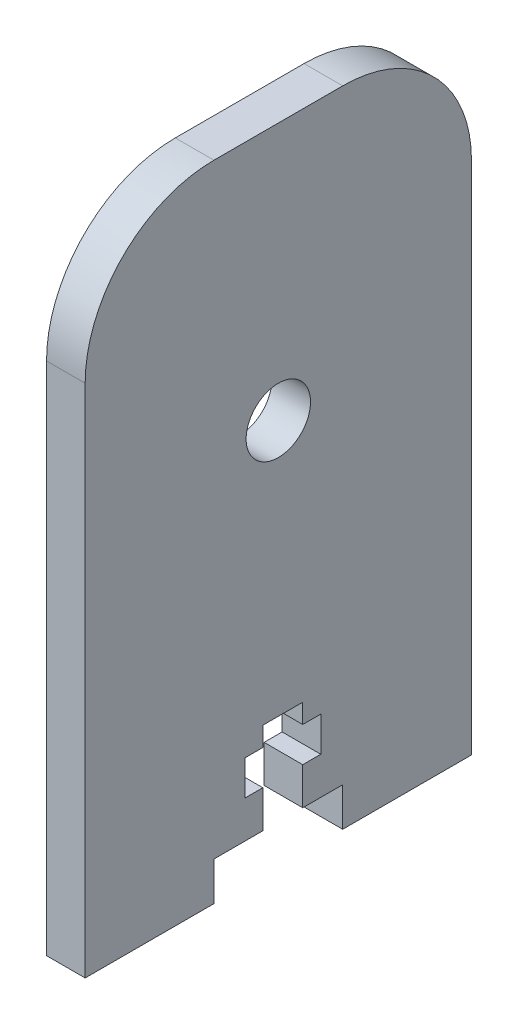
ISO-10303-21;
HEADER;
FILE_DESCRIPTION(('STEP AP214'),'2;1');
FILE_NAME('part.step','',(''),(''),'','','');
FILE_SCHEMA(('AUTOMOTIVE_DESIGN { 1 0 10303 214 1 1 1 1 }'));
ENDSEC;
DATA;
#1=APPLICATION_CONTEXT('core data for automotive mechanical design processes');
#2=APPLICATION_PROTOCOL_DEFINITION('international standard','automotive_design',2000,#1);
#3=PRODUCT_CONTEXT('',#1,'mechanical');
#4=PRODUCT('Part','Part','',(#3));
#5=PRODUCT_RELATED_PRODUCT_CATEGORY('part','',(#4));
#6=PRODUCT_DEFINITION_FORMATION('','',#4);
#7=PRODUCT_DEFINITION_CONTEXT('part definition',#1,'design');
#8=PRODUCT_DEFINITION('design','',#6,#7);
#9=PRODUCT_DEFINITION_SHAPE('','',#8);
#10=(LENGTH_UNIT() NAMED_UNIT(*) SI_UNIT(.MILLI.,.METRE.));
#11=(NAMED_UNIT(*) PLANE_ANGLE_UNIT() SI_UNIT($,.RADIAN.));
#12=(NAMED_UNIT(*) SI_UNIT($,.STERADIAN.) SOLID_ANGLE_UNIT());
#13=UNCERTAINTY_MEASURE_WITH_UNIT(LENGTH_MEASURE(1.E-05),#10,'distance_accuracy_value','');
#14=(GEOMETRIC_REPRESENTATION_CONTEXT(3) GLOBAL_UNCERTAINTY_ASSIGNED_CONTEXT((#13)) GLOBAL_UNIT_ASSIGNED_CONTEXT((#10,
#11,#12)) REPRESENTATION_CONTEXT('',''));
#15=CARTESIAN_POINT('',(0.,0.,0.));
#16=DIRECTION('',(0.,0.,1.));
#17=DIRECTION('',(1.,0.,0.));
#18=AXIS2_PLACEMENT_3D('',#15,#16,#17);
#19=CARTESIAN_POINT('',(0.,3.,-10.));
#20=DIRECTION('',(0.,1.,0.));
#21=DIRECTION('',(0.,0.,1.));
#22=AXIS2_PLACEMENT_3D('',#19,#20,#21);
#23=PLANE('',#22);
#24=DIRECTION('',(0.,0.,1.));
#25=VECTOR('',#24,1.);
#26=CARTESIAN_POINT('',(0.,3.,-10.));
#27=LINE('',#26,#25);
#28=CARTESIAN_POINT('',(0.,3.,-13.796178668585));
#29=VERTEX_POINT('',#28);
#30=CARTESIAN_POINT('',(0.,3.,-10.));
#31=VERTEX_POINT('',#30);
#32=EDGE_CURVE('E292',#29,#31,#27,.T.);
#33=ORIENTED_EDGE('',*,*,#32,.F.);
#34=DIRECTION('',(1.,0.,0.));
#35=VECTOR('',#34,1.);
#36=CARTESIAN_POINT('',(0.,3.,-13.796178668585));
#37=LINE('',#36,#35);
#38=CARTESIAN_POINT('',(3.,3.,-13.796178668585));
#39=VERTEX_POINT('',#38);
#40=EDGE_CURVE('E258',#29,#39,#37,.T.);
#41=ORIENTED_EDGE('',*,*,#40,.T.);
#42=DIRECTION('',(0.,0.,1.));
#43=VECTOR('',#42,1.);
#44=CARTESIAN_POINT('',(3.,3.,-10.));
#45=LINE('',#44,#43);
#46=CARTESIAN_POINT('',(3.,3.,-10.));
#47=VERTEX_POINT('',#46);
#48=EDGE_CURVE('E299',#39,#47,#45,.T.);
#49=ORIENTED_EDGE('',*,*,#48,.T.);
#50=DIRECTION('',(1.,0.,0.));
#51=VECTOR('',#50,1.);
#52=CARTESIAN_POINT('',(0.,3.,-10.));
#53=LINE('',#52,#51);
#54=EDGE_CURVE('E302',#31,#47,#53,.T.);
#55=ORIENTED_EDGE('',*,*,#54,.F.);
#56=EDGE_LOOP('',(#33,#41,#49,#55));
#57=FACE_BOUND('',#56,.T.);
#58=ADVANCED_FACE('F33',(#57),#23,.F.);
#59=CARTESIAN_POINT('',(3.,0.,0.));
#60=DIRECTION('',(0.,1.,0.));
#61=DIRECTION('',(0.,0.,1.));
#62=AXIS2_PLACEMENT_3D('',#59,#60,#61);
#63=PLANE('',#62);
#64=DIRECTION('',(0.,0.,-1.));
#65=VECTOR('',#64,1.);
#66=CARTESIAN_POINT('',(0.,0.,0.));
#67=LINE('',#66,#65);
#68=CARTESIAN_POINT('',(0.,0.,0.));
#69=VERTEX_POINT('',#68);
#70=CARTESIAN_POINT('',(0.,0.,-10.));
#71=VERTEX_POINT('',#70);
#72=EDGE_CURVE('E328',#69,#71,#67,.T.);
#73=ORIENTED_EDGE('',*,*,#72,.T.);
#74=DIRECTION('',(1.,0.,0.));
#75=VECTOR('',#74,1.);
#76=CARTESIAN_POINT('',(0.,0.,-10.));
#77=LINE('',#76,#75);
#78=CARTESIAN_POINT('',(3.,0.,-10.));
#79=VERTEX_POINT('',#78);
#80=EDGE_CURVE('E294',#71,#79,#77,.T.);
#81=ORIENTED_EDGE('',*,*,#80,.T.);
#82=DIRECTION('',(0.,0.,-1.));
#83=VECTOR('',#82,1.);
#84=CARTESIAN_POINT('',(3.,0.,0.));
#85=LINE('',#84,#83);
#86=CARTESIAN_POINT('',(3.,0.,0.));
#87=VERTEX_POINT('',#86);
#88=EDGE_CURVE('E316',#87,#79,#85,.T.);
#89=ORIENTED_EDGE('',*,*,#88,.F.);
#90=DIRECTION('',(-1.,0.,0.));
#91=VECTOR('',#90,1.);
#92=CARTESIAN_POINT('',(3.,0.,0.));
#93=LINE('',#92,#91);
#94=EDGE_CURVE('E338',#87,#69,#93,.T.);
#95=ORIENTED_EDGE('',*,*,#94,.T.);
#96=EDGE_LOOP('',(#73,#81,#89,#95));
#97=FACE_BOUND('',#96,.T.);
#98=ADVANCED_FACE('F426',(#97),#63,.F.);
#99=CARTESIAN_POINT('',(3.,0.,0.));
#100=DIRECTION('',(0.,0.,-1.));
#101=DIRECTION('',(-1.,0.,0.));
#102=AXIS2_PLACEMENT_3D('',#99,#100,#101);
#103=PLANE('',#102);
#104=DIRECTION('',(0.,-1.,0.));
#105=VECTOR('',#104,1.);
#106=CARTESIAN_POINT('',(3.,0.,0.));
#107=LINE('',#106,#105);
#108=CARTESIAN_POINT('',(3.,40.,0.));
#109=VERTEX_POINT('',#108);
#110=EDGE_CURVE('E312',#109,#87,#107,.T.);
#111=ORIENTED_EDGE('',*,*,#110,.F.);
#112=DIRECTION('',(-1.,0.,0.));
#113=VECTOR('',#112,1.);
#114=CARTESIAN_POINT('',(3.,40.,0.));
#115=LINE('',#114,#113);
#116=CARTESIAN_POINT('',(0.,40.,0.));
#117=VERTEX_POINT('',#116);
#118=EDGE_CURVE('E11',#109,#117,#115,.T.);
#119=ORIENTED_EDGE('',*,*,#118,.T.);
#120=DIRECTION('',(0.,-1.,0.));
#121=VECTOR('',#120,1.);
#122=CARTESIAN_POINT('',(0.,0.,0.));
#123=LINE('',#122,#121);
#124=EDGE_CURVE('E305',#117,#69,#123,.T.);
#125=ORIENTED_EDGE('',*,*,#124,.T.);
#126=ORIENTED_EDGE('',*,*,#94,.F.);
#127=EDGE_LOOP('',(#111,#119,#125,#126));
#128=FACE_BOUND('',#127,.T.);
#129=ADVANCED_FACE('F432',(#128),#103,.F.);
#130=CARTESIAN_POINT('',(3.,0.,-20.));
#131=VERTEX_POINT('',#130);
#132=CARTESIAN_POINT('',(3.,0.,-30.));
#133=VERTEX_POINT('',#132);
#134=EDGE_CURVE('E314',#131,#133,#85,.T.);
#135=ORIENTED_EDGE('',*,*,#134,.F.);
#136=DIRECTION('',(1.,0.,0.));
#137=VECTOR('',#136,1.);
#138=CARTESIAN_POINT('',(0.,0.,-20.));
#139=LINE('',#138,#137);
#140=CARTESIAN_POINT('',(0.,0.,-20.));
#141=VERTEX_POINT('',#140);
#142=EDGE_CURVE('E308',#141,#131,#139,.T.);
#143=ORIENTED_EDGE('',*,*,#142,.F.);
#144=CARTESIAN_POINT('',(0.,0.,-30.));
#145=VERTEX_POINT('',#144);
#146=EDGE_CURVE('E327',#141,#145,#67,.T.);
#147=ORIENTED_EDGE('',*,*,#146,.T.);
#148=DIRECTION('',(-1.,0.,0.));
#149=VECTOR('',#148,1.);
#150=CARTESIAN_POINT('',(3.,0.,-30.));
#151=LINE('',#150,#149);
#152=EDGE_CURVE('E325',#133,#145,#151,.T.);
#153=ORIENTED_EDGE('',*,*,#152,.F.);
#154=EDGE_LOOP('',(#135,#143,#147,#153));
#155=FACE_BOUND('',#154,.T.);
#156=ADVANCED_FACE('F375',(#155),#63,.F.);
#157=CARTESIAN_POINT('',(3.,0.,-30.));
#158=DIRECTION('',(0.,0.,1.));
#159=DIRECTION('',(1.,0.,0.));
#160=AXIS2_PLACEMENT_3D('',#157,#158,#159);
#161=PLANE('',#160);
#162=DIRECTION('',(0.,1.,0.));
#163=VECTOR('',#162,1.);
#164=CARTESIAN_POINT('',(0.,0.,-30.));
#165=LINE('',#164,#163);
#166=CARTESIAN_POINT('',(0.,40.,-30.));
#167=VERTEX_POINT('',#166);
#168=EDGE_CURVE('E331',#145,#167,#165,.T.);
#169=ORIENTED_EDGE('',*,*,#168,.T.);
#170=DIRECTION('',(-1.,0.,0.));
#171=VECTOR('',#170,1.);
#172=CARTESIAN_POINT('',(3.,40.,-30.));
#173=LINE('',#172,#171);
#174=CARTESIAN_POINT('',(3.,40.,-30.));
#175=VERTEX_POINT('',#174);
#176=EDGE_CURVE('E350',#167,#175,#173,.F.);
#177=ORIENTED_EDGE('',*,*,#176,.T.);
#178=DIRECTION('',(0.,1.,0.));
#179=VECTOR('',#178,1.);
#180=CARTESIAN_POINT('',(3.,0.,-30.));
#181=LINE('',#180,#179);
#182=EDGE_CURVE('E319',#133,#175,#181,.T.);
#183=ORIENTED_EDGE('',*,*,#182,.F.);
#184=ORIENTED_EDGE('',*,*,#152,.T.);
#185=EDGE_LOOP('',(#169,#177,#183,#184));
#186=FACE_BOUND('',#185,.T.);
#187=ADVANCED_FACE('F371',(#186),#161,.F.);
#188=CARTESIAN_POINT('',(3.,50.,0.));
#189=DIRECTION('',(0.,-1.,0.));
#190=DIRECTION('',(0.,0.,-1.));
#191=AXIS2_PLACEMENT_3D('',#188,#189,#190);
#192=PLANE('',#191);
#193=DIRECTION('',(0.,0.,1.));
#194=VECTOR('',#193,1.);
#195=CARTESIAN_POINT('',(3.,50.,0.));
#196=LINE('',#195,#194);
#197=CARTESIAN_POINT('',(3.,50.,-20.));
#198=VERTEX_POINT('',#197);
#199=CARTESIAN_POINT('',(3.,50.,-10.));
#200=VERTEX_POINT('',#199);
#201=EDGE_CURVE('E322',#198,#200,#196,.T.);
#202=ORIENTED_EDGE('',*,*,#201,.F.);
#203=DIRECTION('',(-1.,0.,0.));
#204=VECTOR('',#203,1.);
#205=CARTESIAN_POINT('',(3.,50.,-20.));
#206=LINE('',#205,#204);
#207=CARTESIAN_POINT('',(0.,50.,-20.));
#208=VERTEX_POINT('',#207);
#209=EDGE_CURVE('E343',#198,#208,#206,.T.);
#210=ORIENTED_EDGE('',*,*,#209,.T.);
#211=DIRECTION('',(0.,0.,1.));
#212=VECTOR('',#211,1.);
#213=CARTESIAN_POINT('',(0.,50.,0.));
#214=LINE('',#213,#212);
#215=CARTESIAN_POINT('',(0.,50.,-10.));
#216=VERTEX_POINT('',#215);
#217=EDGE_CURVE('E315',#208,#216,#214,.T.);
#218=ORIENTED_EDGE('',*,*,#217,.T.);
#219=DIRECTION('',(-1.,0.,0.));
#220=VECTOR('',#219,1.);
#221=CARTESIAN_POINT('',(3.,50.,-10.));
#222=LINE('',#221,#220);
#223=EDGE_CURVE('E341',#216,#200,#222,.F.);
#224=ORIENTED_EDGE('',*,*,#223,.T.);
#225=EDGE_LOOP('',(#202,#210,#218,#224));
#226=FACE_BOUND('',#225,.T.);
#227=ADVANCED_FACE('F364',(#226),#192,.F.);
#228=CARTESIAN_POINT('',(3.,0.,0.));
#229=DIRECTION('',(-1.,0.,0.));
#230=DIRECTION('',(0.,0.,1.));
#231=AXIS2_PLACEMENT_3D('',#228,#229,#230);
#232=PLANE('',#231);
#233=CARTESIAN_POINT('',(3.,30.,-15.));
#234=DIRECTION('',(1.,0.,0.));
#235=DIRECTION('',(0.,0.,-1.));
#236=AXIS2_PLACEMENT_3D('',#233,#234,#235);
#237=CIRCLE('',#236,2.5);
#238=CARTESIAN_POINT('',(3.,30.,-17.5));
#239=VERTEX_POINT('',#238);
#240=EDGE_CURVE('E261',#239,#239,#237,.T.);
#241=ORIENTED_EDGE('',*,*,#240,.F.);
#242=EDGE_LOOP('',(#241));
#243=FACE_BOUND('',#242,.T.);
#244=ORIENTED_EDGE('',*,*,#48,.F.);
#245=DIRECTION('',(0.,-1.,0.));
#246=VECTOR('',#245,1.);
#247=CARTESIAN_POINT('',(3.,3.,-13.796178668585));
#248=LINE('',#247,#246);
#249=CARTESIAN_POINT('',(3.,5.9,-13.796178668585));
#250=VERTEX_POINT('',#249);
#251=EDGE_CURVE('E203',#250,#39,#248,.T.);
#252=ORIENTED_EDGE('',*,*,#251,.F.);
#253=DIRECTION('',(0.,0.,-1.));
#254=VECTOR('',#253,1.);
#255=CARTESIAN_POINT('',(3.,5.9,-13.796178668585));
#256=LINE('',#255,#254);
#257=CARTESIAN_POINT('',(3.,5.9,-12.396178668585));
#258=VERTEX_POINT('',#257);
#259=EDGE_CURVE('E205',#258,#250,#256,.T.);
#260=ORIENTED_EDGE('',*,*,#259,.F.);
#261=DIRECTION('',(0.,-1.,0.));
#262=VECTOR('',#261,1.);
#263=CARTESIAN_POINT('',(3.,5.9,-12.396178668585));
#264=LINE('',#263,#262);
#265=CARTESIAN_POINT('',(3.,8.6,-12.396178668585));
#266=VERTEX_POINT('',#265);
#267=EDGE_CURVE('E253',#266,#258,#264,.T.);
#268=ORIENTED_EDGE('',*,*,#267,.F.);
#269=DIRECTION('',(0.,0.,1.));
#270=VECTOR('',#269,1.);
#271=CARTESIAN_POINT('',(3.,8.6,-12.396178668585));
#272=LINE('',#271,#270);
#273=CARTESIAN_POINT('',(3.,8.6,-13.796178668585));
#274=VERTEX_POINT('',#273);
#275=EDGE_CURVE('E250',#274,#266,#272,.T.);
#276=ORIENTED_EDGE('',*,*,#275,.F.);
#277=DIRECTION('',(0.,-1.,0.));
#278=VECTOR('',#277,1.);
#279=CARTESIAN_POINT('',(3.,8.6,-13.796178668585));
#280=LINE('',#279,#278);
#281=CARTESIAN_POINT('',(3.,10.1,-13.796178668585));
#282=VERTEX_POINT('',#281);
#283=EDGE_CURVE('E247',#282,#274,#280,.T.);
#284=ORIENTED_EDGE('',*,*,#283,.F.);
#285=DIRECTION('',(0.,0.,1.));
#286=VECTOR('',#285,1.);
#287=CARTESIAN_POINT('',(3.,10.1,-13.796178668585));
#288=LINE('',#287,#286);
#289=CARTESIAN_POINT('',(3.,10.1,-16.896178668585));
#290=VERTEX_POINT('',#289);
#291=EDGE_CURVE('E244',#290,#282,#288,.T.);
#292=ORIENTED_EDGE('',*,*,#291,.F.);
#293=DIRECTION('',(0.,1.,0.));
#294=VECTOR('',#293,1.);
#295=CARTESIAN_POINT('',(3.,10.1,-16.896178668585));
#296=LINE('',#295,#294);
#297=CARTESIAN_POINT('',(3.,8.6,-16.896178668585));
#298=VERTEX_POINT('',#297);
#299=EDGE_CURVE('E241',#298,#290,#296,.T.);
#300=ORIENTED_EDGE('',*,*,#299,.F.);
#301=DIRECTION('',(0.,0.,1.));
#302=VECTOR('',#301,1.);
#303=CARTESIAN_POINT('',(3.,8.6,-16.896178668585));
#304=LINE('',#303,#302);
#305=CARTESIAN_POINT('',(3.,8.6,-18.296178668585));
#306=VERTEX_POINT('',#305);
#307=EDGE_CURVE('E238',#306,#298,#304,.T.);
#308=ORIENTED_EDGE('',*,*,#307,.F.);
#309=DIRECTION('',(0.,1.,0.));
#310=VECTOR('',#309,1.);
#311=CARTESIAN_POINT('',(3.,8.6,-18.296178668585));
#312=LINE('',#311,#310);
#313=CARTESIAN_POINT('',(3.,5.9,-18.296178668585));
#314=VERTEX_POINT('',#313);
#315=EDGE_CURVE('E235',#314,#306,#312,.T.);
#316=ORIENTED_EDGE('',*,*,#315,.F.);
#317=DIRECTION('',(0.,0.,-1.));
#318=VECTOR('',#317,1.);
#319=CARTESIAN_POINT('',(3.,5.9,-18.296178668585));
#320=LINE('',#319,#318);
#321=CARTESIAN_POINT('',(3.,5.9,-16.896178668585));
#322=VERTEX_POINT('',#321);
#323=EDGE_CURVE('E233',#322,#314,#320,.T.);
#324=ORIENTED_EDGE('',*,*,#323,.F.);
#325=DIRECTION('',(0.,1.,0.));
#326=VECTOR('',#325,1.);
#327=CARTESIAN_POINT('',(3.,5.9,-16.896178668585));
#328=LINE('',#327,#326);
#329=CARTESIAN_POINT('',(3.,3.,-16.896178668585));
#330=VERTEX_POINT('',#329);
#331=EDGE_CURVE('E184',#330,#322,#328,.T.);
#332=ORIENTED_EDGE('',*,*,#331,.F.);
#333=CARTESIAN_POINT('',(3.,3.,-20.));
#334=VERTEX_POINT('',#333);
#335=EDGE_CURVE('E290',#334,#330,#45,.T.);
#336=ORIENTED_EDGE('',*,*,#335,.F.);
#337=DIRECTION('',(0.,1.,0.));
#338=VECTOR('',#337,1.);
#339=CARTESIAN_POINT('',(3.,0.,-20.));
#340=LINE('',#339,#338);
#341=EDGE_CURVE('E296',#131,#334,#340,.T.);
#342=ORIENTED_EDGE('',*,*,#341,.F.);
#343=ORIENTED_EDGE('',*,*,#134,.T.);
#344=ORIENTED_EDGE('',*,*,#182,.T.);
#345=CARTESIAN_POINT('',(3.,40.,-20.));
#346=DIRECTION('',(-1.,0.,0.));
#347=DIRECTION('',(0.,0.,1.));
#348=AXIS2_PLACEMENT_3D('',#345,#346,#347);
#349=CIRCLE('',#348,10.);
#350=EDGE_CURVE('E41',#175,#198,#349,.F.);
#351=ORIENTED_EDGE('',*,*,#350,.T.);
#352=ORIENTED_EDGE('',*,*,#201,.T.);
#353=CARTESIAN_POINT('',(3.,40.,-10.));
#354=DIRECTION('',(-1.,0.,0.));
#355=DIRECTION('',(0.,0.,1.));
#356=AXIS2_PLACEMENT_3D('',#353,#354,#355);
#357=CIRCLE('',#356,10.);
#358=EDGE_CURVE('E352',#200,#109,#357,.F.);
#359=ORIENTED_EDGE('',*,*,#358,.T.);
#360=ORIENTED_EDGE('',*,*,#110,.T.);
#361=ORIENTED_EDGE('',*,*,#88,.T.);
#362=DIRECTION('',(0.,-1.,0.));
#363=VECTOR('',#362,1.);
#364=CARTESIAN_POINT('',(3.,0.,-10.));
#365=LINE('',#364,#363);
#366=EDGE_CURVE('E285',#47,#79,#365,.T.);
#367=ORIENTED_EDGE('',*,*,#366,.F.);
#368=EDGE_LOOP('',(#244,#252,#260,#268,#276,#284,#292,#300,#308,#316,#324,#332,#336,#342,#343,
#344,#351,#352,#359,#360,#361,#367));
#369=FACE_BOUND('',#368,.T.);
#370=ADVANCED_FACE('F357',(#243,#369),#232,.F.);
#371=CARTESIAN_POINT('',(0.,0.,0.));
#372=DIRECTION('',(-1.,0.,0.));
#373=DIRECTION('',(0.,0.,1.));
#374=AXIS2_PLACEMENT_3D('',#371,#372,#373);
#375=PLANE('',#374);
#376=DIRECTION('',(0.,-1.,0.));
#377=VECTOR('',#376,1.);
#378=CARTESIAN_POINT('',(0.,3.,-13.796178668585));
#379=LINE('',#378,#377);
#380=CARTESIAN_POINT('',(0.,5.9,-13.796178668585));
#381=VERTEX_POINT('',#380);
#382=EDGE_CURVE('E230',#381,#29,#379,.T.);
#383=ORIENTED_EDGE('',*,*,#382,.T.);
#384=ORIENTED_EDGE('',*,*,#32,.T.);
#385=DIRECTION('',(0.,-1.,0.));
#386=VECTOR('',#385,1.);
#387=CARTESIAN_POINT('',(0.,0.,-10.));
#388=LINE('',#387,#386);
#389=EDGE_CURVE('E286',#31,#71,#388,.T.);
#390=ORIENTED_EDGE('',*,*,#389,.T.);
#391=ORIENTED_EDGE('',*,*,#72,.F.);
#392=ORIENTED_EDGE('',*,*,#124,.F.);
#393=CARTESIAN_POINT('',(0.,40.,-10.));
#394=DIRECTION('',(-1.,0.,0.));
#395=DIRECTION('',(0.,0.,1.));
#396=AXIS2_PLACEMENT_3D('',#393,#394,#395);
#397=CIRCLE('',#396,10.);
#398=EDGE_CURVE('E346',#117,#216,#397,.T.);
#399=ORIENTED_EDGE('',*,*,#398,.T.);
#400=ORIENTED_EDGE('',*,*,#217,.F.);
#401=CARTESIAN_POINT('',(0.,40.,-20.));
#402=DIRECTION('',(-1.,0.,0.));
#403=DIRECTION('',(0.,0.,1.));
#404=AXIS2_PLACEMENT_3D('',#401,#402,#403);
#405=CIRCLE('',#404,10.);
#406=EDGE_CURVE('E348',#208,#167,#405,.T.);
#407=ORIENTED_EDGE('',*,*,#406,.T.);
#408=ORIENTED_EDGE('',*,*,#168,.F.);
#409=ORIENTED_EDGE('',*,*,#146,.F.);
#410=DIRECTION('',(0.,1.,0.));
#411=VECTOR('',#410,1.);
#412=CARTESIAN_POINT('',(0.,0.,-20.));
#413=LINE('',#412,#411);
#414=CARTESIAN_POINT('',(0.,3.,-20.));
#415=VERTEX_POINT('',#414);
#416=EDGE_CURVE('E289',#141,#415,#413,.T.);
#417=ORIENTED_EDGE('',*,*,#416,.T.);
#418=CARTESIAN_POINT('',(0.,3.,-16.896178668585));
#419=VERTEX_POINT('',#418);
#420=EDGE_CURVE('E55',#415,#419,#27,.T.);
#421=ORIENTED_EDGE('',*,*,#420,.T.);
#422=DIRECTION('',(0.,1.,0.));
#423=VECTOR('',#422,1.);
#424=CARTESIAN_POINT('',(0.,5.9,-16.896178668585));
#425=LINE('',#424,#423);
#426=CARTESIAN_POINT('',(0.,5.9,-16.896178668585));
#427=VERTEX_POINT('',#426);
#428=EDGE_CURVE('E48',#419,#427,#425,.T.);
#429=ORIENTED_EDGE('',*,*,#428,.T.);
#430=DIRECTION('',(0.,0.,-1.));
#431=VECTOR('',#430,1.);
#432=CARTESIAN_POINT('',(0.,5.9,-18.296178668585));
#433=LINE('',#432,#431);
#434=CARTESIAN_POINT('',(0.,5.9,-18.296178668585));
#435=VERTEX_POINT('',#434);
#436=EDGE_CURVE('E192',#427,#435,#433,.T.);
#437=ORIENTED_EDGE('',*,*,#436,.T.);
#438=DIRECTION('',(0.,1.,0.));
#439=VECTOR('',#438,1.);
#440=CARTESIAN_POINT('',(0.,8.6,-18.296178668585));
#441=LINE('',#440,#439);
#442=CARTESIAN_POINT('',(0.,8.6,-18.296178668585));
#443=VERTEX_POINT('',#442);
#444=EDGE_CURVE('E197',#435,#443,#441,.T.);
#445=ORIENTED_EDGE('',*,*,#444,.T.);
#446=DIRECTION('',(0.,0.,1.));
#447=VECTOR('',#446,1.);
#448=CARTESIAN_POINT('',(0.,8.6,-16.896178668585));
#449=LINE('',#448,#447);
#450=CARTESIAN_POINT('',(0.,8.6,-16.896178668585));
#451=VERTEX_POINT('',#450);
#452=EDGE_CURVE('E209',#443,#451,#449,.T.);
#453=ORIENTED_EDGE('',*,*,#452,.T.);
#454=DIRECTION('',(0.,1.,0.));
#455=VECTOR('',#454,1.);
#456=CARTESIAN_POINT('',(0.,10.1,-16.896178668585));
#457=LINE('',#456,#455);
#458=CARTESIAN_POINT('',(0.,10.1,-16.896178668585));
#459=VERTEX_POINT('',#458);
#460=EDGE_CURVE('E212',#451,#459,#457,.T.);
#461=ORIENTED_EDGE('',*,*,#460,.T.);
#462=DIRECTION('',(0.,0.,1.));
#463=VECTOR('',#462,1.);
#464=CARTESIAN_POINT('',(0.,10.1,-13.796178668585));
#465=LINE('',#464,#463);
#466=CARTESIAN_POINT('',(0.,10.1,-13.796178668585));
#467=VERTEX_POINT('',#466);
#468=EDGE_CURVE('E215',#459,#467,#465,.T.);
#469=ORIENTED_EDGE('',*,*,#468,.T.);
#470=DIRECTION('',(0.,-1.,0.));
#471=VECTOR('',#470,1.);
#472=CARTESIAN_POINT('',(0.,8.6,-13.796178668585));
#473=LINE('',#472,#471);
#474=CARTESIAN_POINT('',(0.,8.6,-13.796178668585));
#475=VERTEX_POINT('',#474);
#476=EDGE_CURVE('E218',#467,#475,#473,.T.);
#477=ORIENTED_EDGE('',*,*,#476,.T.);
#478=DIRECTION('',(0.,0.,1.));
#479=VECTOR('',#478,1.);
#480=CARTESIAN_POINT('',(0.,8.6,-12.396178668585));
#481=LINE('',#480,#479);
#482=CARTESIAN_POINT('',(0.,8.6,-12.396178668585));
#483=VERTEX_POINT('',#482);
#484=EDGE_CURVE('E221',#475,#483,#481,.T.);
#485=ORIENTED_EDGE('',*,*,#484,.T.);
#486=DIRECTION('',(0.,-1.,0.));
#487=VECTOR('',#486,1.);
#488=CARTESIAN_POINT('',(0.,5.9,-12.396178668585));
#489=LINE('',#488,#487);
#490=CARTESIAN_POINT('',(0.,5.9,-12.396178668585));
#491=VERTEX_POINT('',#490);
#492=EDGE_CURVE('E224',#483,#491,#489,.T.);
#493=ORIENTED_EDGE('',*,*,#492,.T.);
#494=DIRECTION('',(0.,0.,-1.));
#495=VECTOR('',#494,1.);
#496=CARTESIAN_POINT('',(0.,5.9,-13.796178668585));
#497=LINE('',#496,#495);
#498=EDGE_CURVE('E227',#491,#381,#497,.T.);
#499=ORIENTED_EDGE('',*,*,#498,.T.);
#500=EDGE_LOOP('',(#383,#384,#390,#391,#392,#399,#400,#407,#408,#409,#417,#421,#429,#437,#445,
#453,#461,#469,#477,#485,#493,#499));
#501=FACE_BOUND('',#500,.T.);
#502=CARTESIAN_POINT('',(0.,30.,-15.));
#503=DIRECTION('',(1.,0.,0.));
#504=DIRECTION('',(0.,0.,-1.));
#505=AXIS2_PLACEMENT_3D('',#502,#503,#504);
#506=CIRCLE('',#505,2.5);
#507=CARTESIAN_POINT('',(0.,30.,-17.5));
#508=VERTEX_POINT('',#507);
#509=EDGE_CURVE('E282',#508,#508,#506,.T.);
#510=ORIENTED_EDGE('',*,*,#509,.T.);
#511=EDGE_LOOP('',(#510));
#512=FACE_BOUND('',#511,.T.);
#513=ADVANCED_FACE('F200',(#501,#512),#375,.T.);
#514=CARTESIAN_POINT('',(3.,40.,-20.));
#515=DIRECTION('',(-1.,0.,0.));
#516=DIRECTION('',(0.,0.,1.));
#517=AXIS2_PLACEMENT_3D('',#514,#515,#516);
#518=CYLINDRICAL_SURFACE('',#517,10.);
#519=ORIENTED_EDGE('',*,*,#350,.F.);
#520=ORIENTED_EDGE('',*,*,#176,.F.);
#521=ORIENTED_EDGE('',*,*,#406,.F.);
#522=ORIENTED_EDGE('',*,*,#209,.F.);
#523=EDGE_LOOP('',(#519,#520,#521,#522));
#524=FACE_BOUND('',#523,.T.);
#525=ADVANCED_FACE('F367',(#524),#518,.T.);
#526=CARTESIAN_POINT('',(3.,40.,-10.));
#527=DIRECTION('',(-1.,0.,0.));
#528=DIRECTION('',(0.,0.,1.));
#529=AXIS2_PLACEMENT_3D('',#526,#527,#528);
#530=CYLINDRICAL_SURFACE('',#529,10.);
#531=ORIENTED_EDGE('',*,*,#358,.F.);
#532=ORIENTED_EDGE('',*,*,#223,.F.);
#533=ORIENTED_EDGE('',*,*,#398,.F.);
#534=ORIENTED_EDGE('',*,*,#118,.F.);
#535=EDGE_LOOP('',(#531,#532,#533,#534));
#536=FACE_BOUND('',#535,.T.);
#537=ADVANCED_FACE('F35',(#536),#530,.T.);
#538=CARTESIAN_POINT('',(0.,0.,-10.));
#539=DIRECTION('',(0.,0.,1.));
#540=DIRECTION('',(0.,-1.,0.));
#541=AXIS2_PLACEMENT_3D('',#538,#539,#540);
#542=PLANE('',#541);
#543=ORIENTED_EDGE('',*,*,#366,.T.);
#544=ORIENTED_EDGE('',*,*,#80,.F.);
#545=ORIENTED_EDGE('',*,*,#389,.F.);
#546=ORIENTED_EDGE('',*,*,#54,.T.);
#547=EDGE_LOOP('',(#543,#544,#545,#546));
#548=FACE_BOUND('',#547,.T.);
#549=ADVANCED_FACE('F423',(#548),#542,.F.);
#550=ORIENTED_EDGE('',*,*,#335,.T.);
#551=DIRECTION('',(1.,0.,0.));
#552=VECTOR('',#551,1.);
#553=CARTESIAN_POINT('',(0.,3.,-16.896178668585));
#554=LINE('',#553,#552);
#555=EDGE_CURVE('E189',#419,#330,#554,.T.);
#556=ORIENTED_EDGE('',*,*,#555,.F.);
#557=ORIENTED_EDGE('',*,*,#420,.F.);
#558=DIRECTION('',(1.,0.,0.));
#559=VECTOR('',#558,1.);
#560=CARTESIAN_POINT('',(0.,3.,-20.));
#561=LINE('',#560,#559);
#562=EDGE_CURVE('E306',#415,#334,#561,.T.);
#563=ORIENTED_EDGE('',*,*,#562,.T.);
#564=EDGE_LOOP('',(#550,#556,#557,#563));
#565=FACE_BOUND('',#564,.T.);
#566=ADVANCED_FACE('F381',(#565),#23,.F.);
#567=CARTESIAN_POINT('',(0.,0.,-20.));
#568=DIRECTION('',(0.,0.,-1.));
#569=DIRECTION('',(-1.,0.,0.));
#570=AXIS2_PLACEMENT_3D('',#567,#568,#569);
#571=PLANE('',#570);
#572=ORIENTED_EDGE('',*,*,#341,.T.);
#573=ORIENTED_EDGE('',*,*,#562,.F.);
#574=ORIENTED_EDGE('',*,*,#416,.F.);
#575=ORIENTED_EDGE('',*,*,#142,.T.);
#576=EDGE_LOOP('',(#572,#573,#574,#575));
#577=FACE_BOUND('',#576,.T.);
#578=ADVANCED_FACE('F378',(#577),#571,.F.);
#579=CARTESIAN_POINT('',(3.,30.,-15.));
#580=DIRECTION('',(1.,0.,0.));
#581=DIRECTION('',(0.,0.,-1.));
#582=AXIS2_PLACEMENT_3D('',#579,#580,#581);
#583=CYLINDRICAL_SURFACE('',#582,2.5);
#584=ORIENTED_EDGE('',*,*,#509,.F.);
#585=EDGE_LOOP('',(#584));
#586=FACE_BOUND('',#585,.T.);
#587=ORIENTED_EDGE('',*,*,#240,.T.);
#588=EDGE_LOOP('',(#587));
#589=FACE_BOUND('',#588,.T.);
#590=ADVANCED_FACE('F453',(#586,#589),#583,.F.);
#591=CARTESIAN_POINT('',(0.,3.,-13.796178668585));
#592=DIRECTION('',(0.,0.,1.));
#593=DIRECTION('',(1.,0.,0.));
#594=AXIS2_PLACEMENT_3D('',#591,#592,#593);
#595=PLANE('',#594);
#596=ORIENTED_EDGE('',*,*,#251,.T.);
#597=ORIENTED_EDGE('',*,*,#40,.F.);
#598=ORIENTED_EDGE('',*,*,#382,.F.);
#599=DIRECTION('',(1.,0.,0.));
#600=VECTOR('',#599,1.);
#601=CARTESIAN_POINT('',(0.,5.9,-13.796178668585));
#602=LINE('',#601,#600);
#603=EDGE_CURVE('E262',#381,#250,#602,.T.);
#604=ORIENTED_EDGE('',*,*,#603,.T.);
#605=EDGE_LOOP('',(#596,#597,#598,#604));
#606=FACE_BOUND('',#605,.T.);
#607=ADVANCED_FACE('F417',(#606),#595,.F.);
#608=CARTESIAN_POINT('',(0.,5.9,-13.796178668585));
#609=DIRECTION('',(0.,-1.,0.));
#610=DIRECTION('',(0.,0.,-1.));
#611=AXIS2_PLACEMENT_3D('',#608,#609,#610);
#612=PLANE('',#611);
#613=ORIENTED_EDGE('',*,*,#259,.T.);
#614=ORIENTED_EDGE('',*,*,#603,.F.);
#615=ORIENTED_EDGE('',*,*,#498,.F.);
#616=DIRECTION('',(1.,0.,0.));
#617=VECTOR('',#616,1.);
#618=CARTESIAN_POINT('',(0.,5.9,-12.396178668585));
#619=LINE('',#618,#617);
#620=EDGE_CURVE('E264',#491,#258,#619,.T.);
#621=ORIENTED_EDGE('',*,*,#620,.T.);
#622=EDGE_LOOP('',(#613,#614,#615,#621));
#623=FACE_BOUND('',#622,.T.);
#624=ADVANCED_FACE('F413',(#623),#612,.F.);
#625=CARTESIAN_POINT('',(0.,5.9,-12.396178668585));
#626=DIRECTION('',(0.,0.,1.));
#627=DIRECTION('',(1.,0.,0.));
#628=AXIS2_PLACEMENT_3D('',#625,#626,#627);
#629=PLANE('',#628);
#630=ORIENTED_EDGE('',*,*,#267,.T.);
#631=ORIENTED_EDGE('',*,*,#620,.F.);
#632=ORIENTED_EDGE('',*,*,#492,.F.);
#633=DIRECTION('',(1.,0.,0.));
#634=VECTOR('',#633,1.);
#635=CARTESIAN_POINT('',(0.,8.6,-12.396178668585));
#636=LINE('',#635,#634);
#637=EDGE_CURVE('E266',#483,#266,#636,.T.);
#638=ORIENTED_EDGE('',*,*,#637,.T.);
#639=EDGE_LOOP('',(#630,#631,#632,#638));
#640=FACE_BOUND('',#639,.T.);
#641=ADVANCED_FACE('F408',(#640),#629,.F.);
#642=CARTESIAN_POINT('',(0.,8.6,-12.396178668585));
#643=DIRECTION('',(0.,1.,0.));
#644=DIRECTION('',(0.,0.,1.));
#645=AXIS2_PLACEMENT_3D('',#642,#643,#644);
#646=PLANE('',#645);
#647=ORIENTED_EDGE('',*,*,#275,.T.);
#648=ORIENTED_EDGE('',*,*,#637,.F.);
#649=ORIENTED_EDGE('',*,*,#484,.F.);
#650=DIRECTION('',(1.,0.,0.));
#651=VECTOR('',#650,1.);
#652=CARTESIAN_POINT('',(0.,8.6,-13.796178668585));
#653=LINE('',#652,#651);
#654=EDGE_CURVE('E268',#475,#274,#653,.T.);
#655=ORIENTED_EDGE('',*,*,#654,.T.);
#656=EDGE_LOOP('',(#647,#648,#649,#655));
#657=FACE_BOUND('',#656,.T.);
#658=ADVANCED_FACE('F404',(#657),#646,.F.);
#659=CARTESIAN_POINT('',(0.,8.6,-13.796178668585));
#660=DIRECTION('',(0.,0.,1.));
#661=DIRECTION('',(1.,0.,0.));
#662=AXIS2_PLACEMENT_3D('',#659,#660,#661);
#663=PLANE('',#662);
#664=ORIENTED_EDGE('',*,*,#283,.T.);
#665=ORIENTED_EDGE('',*,*,#654,.F.);
#666=ORIENTED_EDGE('',*,*,#476,.F.);
#667=DIRECTION('',(1.,0.,0.));
#668=VECTOR('',#667,1.);
#669=CARTESIAN_POINT('',(0.,10.1,-13.796178668585));
#670=LINE('',#669,#668);
#671=EDGE_CURVE('E270',#467,#282,#670,.T.);
#672=ORIENTED_EDGE('',*,*,#671,.T.);
#673=EDGE_LOOP('',(#664,#665,#666,#672));
#674=FACE_BOUND('',#673,.T.);
#675=ADVANCED_FACE('F400',(#674),#663,.F.);
#676=CARTESIAN_POINT('',(0.,10.1,-13.796178668585));
#677=DIRECTION('',(0.,1.,0.));
#678=DIRECTION('',(0.,0.,1.));
#679=AXIS2_PLACEMENT_3D('',#676,#677,#678);
#680=PLANE('',#679);
#681=ORIENTED_EDGE('',*,*,#291,.T.);
#682=ORIENTED_EDGE('',*,*,#671,.F.);
#683=ORIENTED_EDGE('',*,*,#468,.F.);
#684=DIRECTION('',(1.,0.,0.));
#685=VECTOR('',#684,1.);
#686=CARTESIAN_POINT('',(0.,10.1,-16.896178668585));
#687=LINE('',#686,#685);
#688=EDGE_CURVE('E272',#459,#290,#687,.T.);
#689=ORIENTED_EDGE('',*,*,#688,.T.);
#690=EDGE_LOOP('',(#681,#682,#683,#689));
#691=FACE_BOUND('',#690,.T.);
#692=ADVANCED_FACE('F396',(#691),#680,.F.);
#693=CARTESIAN_POINT('',(0.,10.1,-16.896178668585));
#694=DIRECTION('',(0.,0.,-1.));
#695=DIRECTION('',(-1.,0.,0.));
#696=AXIS2_PLACEMENT_3D('',#693,#694,#695);
#697=PLANE('',#696);
#698=ORIENTED_EDGE('',*,*,#299,.T.);
#699=ORIENTED_EDGE('',*,*,#688,.F.);
#700=ORIENTED_EDGE('',*,*,#460,.F.);
#701=DIRECTION('',(1.,0.,0.));
#702=VECTOR('',#701,1.);
#703=CARTESIAN_POINT('',(0.,8.6,-16.896178668585));
#704=LINE('',#703,#702);
#705=EDGE_CURVE('E274',#451,#298,#704,.T.);
#706=ORIENTED_EDGE('',*,*,#705,.T.);
#707=EDGE_LOOP('',(#698,#699,#700,#706));
#708=FACE_BOUND('',#707,.T.);
#709=ADVANCED_FACE('F392',(#708),#697,.F.);
#710=CARTESIAN_POINT('',(0.,8.6,-16.896178668585));
#711=DIRECTION('',(0.,1.,0.));
#712=DIRECTION('',(0.,0.,1.));
#713=AXIS2_PLACEMENT_3D('',#710,#711,#712);
#714=PLANE('',#713);
#715=ORIENTED_EDGE('',*,*,#307,.T.);
#716=ORIENTED_EDGE('',*,*,#705,.F.);
#717=ORIENTED_EDGE('',*,*,#452,.F.);
#718=DIRECTION('',(1.,0.,0.));
#719=VECTOR('',#718,1.);
#720=CARTESIAN_POINT('',(0.,8.6,-18.296178668585));
#721=LINE('',#720,#719);
#722=EDGE_CURVE('E276',#443,#306,#721,.T.);
#723=ORIENTED_EDGE('',*,*,#722,.T.);
#724=EDGE_LOOP('',(#715,#716,#717,#723));
#725=FACE_BOUND('',#724,.T.);
#726=ADVANCED_FACE('F390',(#725),#714,.F.);
#727=CARTESIAN_POINT('',(0.,8.6,-18.296178668585));
#728=DIRECTION('',(0.,0.,-1.));
#729=DIRECTION('',(-1.,0.,0.));
#730=AXIS2_PLACEMENT_3D('',#727,#728,#729);
#731=PLANE('',#730);
#732=ORIENTED_EDGE('',*,*,#315,.T.);
#733=ORIENTED_EDGE('',*,*,#722,.F.);
#734=ORIENTED_EDGE('',*,*,#444,.F.);
#735=DIRECTION('',(1.,0.,0.));
#736=VECTOR('',#735,1.);
#737=CARTESIAN_POINT('',(0.,5.9,-18.296178668585));
#738=LINE('',#737,#736);
#739=EDGE_CURVE('E188',#435,#314,#738,.T.);
#740=ORIENTED_EDGE('',*,*,#739,.T.);
#741=EDGE_LOOP('',(#732,#733,#734,#740));
#742=FACE_BOUND('',#741,.T.);
#743=ADVANCED_FACE('F386',(#742),#731,.F.);
#744=CARTESIAN_POINT('',(0.,5.9,-18.296178668585));
#745=DIRECTION('',(0.,-1.,0.));
#746=DIRECTION('',(0.,0.,-1.));
#747=AXIS2_PLACEMENT_3D('',#744,#745,#746);
#748=PLANE('',#747);
#749=ORIENTED_EDGE('',*,*,#323,.T.);
#750=ORIENTED_EDGE('',*,*,#739,.F.);
#751=ORIENTED_EDGE('',*,*,#436,.F.);
#752=DIRECTION('',(1.,0.,0.));
#753=VECTOR('',#752,1.);
#754=CARTESIAN_POINT('',(0.,5.9,-16.896178668585));
#755=LINE('',#754,#753);
#756=EDGE_CURVE('E180',#427,#322,#755,.T.);
#757=ORIENTED_EDGE('',*,*,#756,.T.);
#758=EDGE_LOOP('',(#749,#750,#751,#757));
#759=FACE_BOUND('',#758,.T.);
#760=ADVANCED_FACE('F193',(#759),#748,.F.);
#761=CARTESIAN_POINT('',(0.,5.9,-16.896178668585));
#762=DIRECTION('',(0.,0.,-1.));
#763=DIRECTION('',(-1.,0.,0.));
#764=AXIS2_PLACEMENT_3D('',#761,#762,#763);
#765=PLANE('',#764);
#766=ORIENTED_EDGE('',*,*,#331,.T.);
#767=ORIENTED_EDGE('',*,*,#756,.F.);
#768=ORIENTED_EDGE('',*,*,#428,.F.);
#769=ORIENTED_EDGE('',*,*,#555,.T.);
#770=EDGE_LOOP('',(#766,#767,#768,#769));
#771=FACE_BOUND('',#770,.T.);
#772=ADVANCED_FACE('F182',(#771),#765,.F.);
#773=CLOSED_SHELL('',(#58,#98,#129,#156,#187,#227,#370,#513,#525,#537,#549,#566,#578,#590,#607,
#624,#641,#658,#675,#692,#709,#726,#743,#760,#772));
#774=MANIFOLD_SOLID_BREP('B2',#773);
#775=ADVANCED_BREP_SHAPE_REPRESENTATION('',(#18,#774),#14);
#776=SHAPE_DEFINITION_REPRESENTATION(#9,#775);
ENDSEC;
END-ISO-10303-21;
